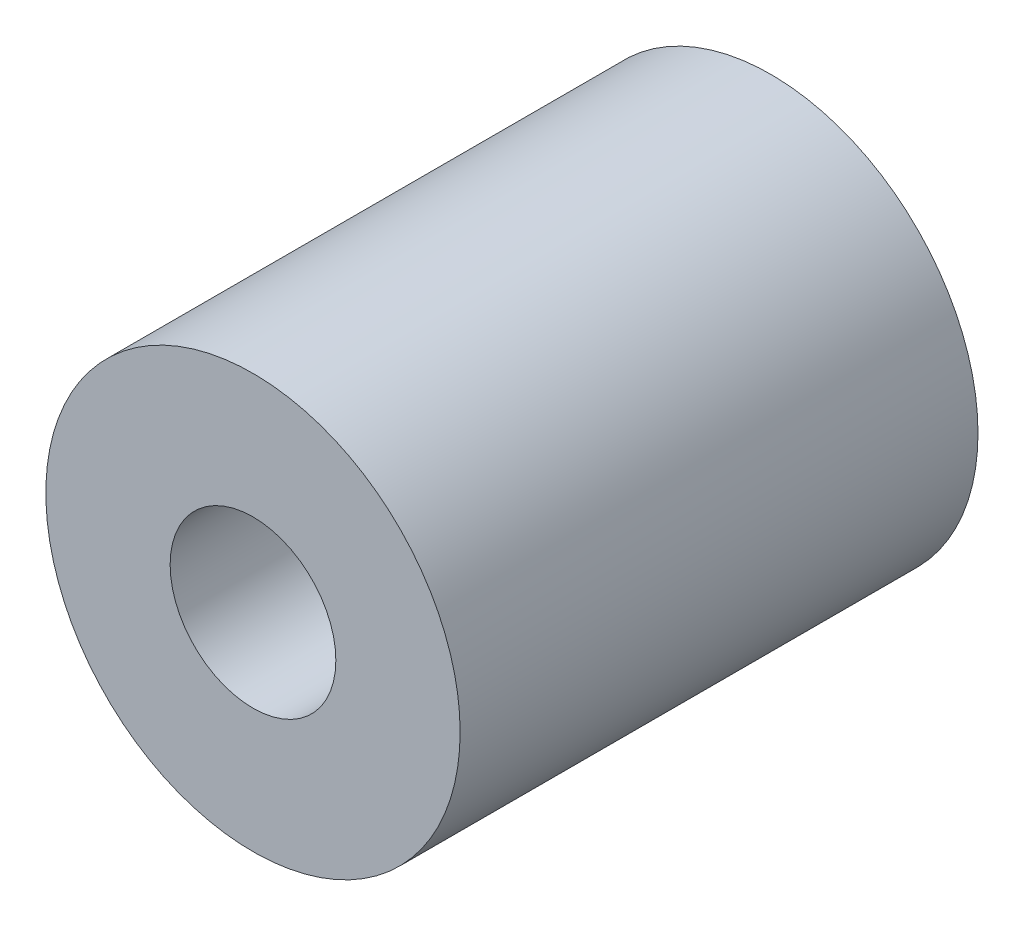
ISO-10303-21;
HEADER;
FILE_DESCRIPTION(('STEP AP214'),'2;1');
FILE_NAME('part.step','',(''),(''),'','','');
FILE_SCHEMA(('AUTOMOTIVE_DESIGN { 1 0 10303 214 1 1 1 1 }'));
ENDSEC;
DATA;
#1=APPLICATION_CONTEXT('core data for automotive mechanical design processes');
#2=APPLICATION_PROTOCOL_DEFINITION('international standard','automotive_design',2000,#1);
#3=PRODUCT_CONTEXT('',#1,'mechanical');
#4=PRODUCT('Part','Part','',(#3));
#5=PRODUCT_RELATED_PRODUCT_CATEGORY('part','',(#4));
#6=PRODUCT_DEFINITION_FORMATION('','',#4);
#7=PRODUCT_DEFINITION_CONTEXT('part definition',#1,'design');
#8=PRODUCT_DEFINITION('design','',#6,#7);
#9=PRODUCT_DEFINITION_SHAPE('','',#8);
#10=(LENGTH_UNIT() NAMED_UNIT(*) SI_UNIT(.MILLI.,.METRE.));
#11=(NAMED_UNIT(*) PLANE_ANGLE_UNIT() SI_UNIT($,.RADIAN.));
#12=(NAMED_UNIT(*) SI_UNIT($,.STERADIAN.) SOLID_ANGLE_UNIT());
#13=UNCERTAINTY_MEASURE_WITH_UNIT(LENGTH_MEASURE(1.E-05),#10,'distance_accuracy_value','');
#14=(GEOMETRIC_REPRESENTATION_CONTEXT(3) GLOBAL_UNCERTAINTY_ASSIGNED_CONTEXT((#13)) GLOBAL_UNIT_ASSIGNED_CONTEXT((#10,
#11,#12)) REPRESENTATION_CONTEXT('',''));
#15=CARTESIAN_POINT('',(0.,0.,0.));
#16=DIRECTION('',(0.,0.,1.));
#17=DIRECTION('',(1.,0.,0.));
#18=AXIS2_PLACEMENT_3D('',#15,#16,#17);
#19=CARTESIAN_POINT('',(0.,0.,12.5));
#20=DIRECTION('',(0.,0.,1.));
#21=DIRECTION('',(1.,0.,0.));
#22=AXIS2_PLACEMENT_3D('',#19,#20,#21);
#23=PLANE('',#22);
#24=CARTESIAN_POINT('',(0.,0.,12.5));
#25=DIRECTION('',(0.,0.,1.));
#26=DIRECTION('',(1.,0.,0.));
#27=AXIS2_PLACEMENT_3D('',#24,#25,#26);
#28=CIRCLE('',#27,2.);
#29=CARTESIAN_POINT('',(2.,0.,12.5));
#30=VERTEX_POINT('',#29);
#31=EDGE_CURVE('E39',#30,#30,#28,.T.);
#32=ORIENTED_EDGE('',*,*,#31,.F.);
#33=EDGE_LOOP('',(#32));
#34=FACE_BOUND('',#33,.T.);
#35=CARTESIAN_POINT('',(0.,0.,12.5));
#36=DIRECTION('',(0.,0.,1.));
#37=DIRECTION('',(1.,0.,0.));
#38=AXIS2_PLACEMENT_3D('',#35,#36,#37);
#39=CIRCLE('',#38,4.);
#40=CARTESIAN_POINT('',(4.,0.,12.5));
#41=VERTEX_POINT('',#40);
#42=EDGE_CURVE('E53',#41,#41,#39,.T.);
#43=ORIENTED_EDGE('',*,*,#42,.T.);
#44=EDGE_LOOP('',(#43));
#45=FACE_BOUND('',#44,.T.);
#46=ADVANCED_FACE('F32',(#34,#45),#23,.T.);
#47=CARTESIAN_POINT('',(0.,0.,0.));
#48=DIRECTION('',(0.,0.,1.));
#49=DIRECTION('',(1.,0.,0.));
#50=AXIS2_PLACEMENT_3D('',#47,#48,#49);
#51=PLANE('',#50);
#52=CARTESIAN_POINT('',(0.,0.,0.));
#53=DIRECTION('',(0.,0.,1.));
#54=DIRECTION('',(1.,0.,0.));
#55=AXIS2_PLACEMENT_3D('',#52,#53,#54);
#56=CIRCLE('',#55,10.);
#57=CARTESIAN_POINT('',(10.,0.,0.));
#58=VERTEX_POINT('',#57);
#59=EDGE_CURVE('E10',#58,#58,#56,.T.);
#60=ORIENTED_EDGE('',*,*,#59,.F.);
#61=EDGE_LOOP('',(#60));
#62=FACE_BOUND('',#61,.T.);
#63=CARTESIAN_POINT('',(0.,0.,0.));
#64=DIRECTION('',(0.,0.,1.));
#65=DIRECTION('',(1.,0.,0.));
#66=AXIS2_PLACEMENT_3D('',#63,#64,#65);
#67=CIRCLE('',#66,2.);
#68=CARTESIAN_POINT('',(2.,0.,0.));
#69=VERTEX_POINT('',#68);
#70=EDGE_CURVE('E43',#69,#69,#67,.T.);
#71=ORIENTED_EDGE('',*,*,#70,.T.);
#72=EDGE_LOOP('',(#71));
#73=FACE_BOUND('',#72,.T.);
#74=ADVANCED_FACE('F74',(#62,#73),#51,.F.);
#75=CARTESIAN_POINT('',(0.,0.,12.5));
#76=DIRECTION('',(0.,0.,-1.));
#77=DIRECTION('',(-1.,0.,0.));
#78=AXIS2_PLACEMENT_3D('',#75,#76,#77);
#79=CYLINDRICAL_SURFACE('',#78,10.);
#80=ORIENTED_EDGE('',*,*,#59,.T.);
#81=EDGE_LOOP('',(#80));
#82=FACE_BOUND('',#81,.T.);
#83=CARTESIAN_POINT('',(0.,0.,25.));
#84=DIRECTION('',(0.,0.,1.));
#85=DIRECTION('',(1.,0.,0.));
#86=AXIS2_PLACEMENT_3D('',#83,#84,#85);
#87=CIRCLE('',#86,10.);
#88=CARTESIAN_POINT('',(10.,0.,25.));
#89=VERTEX_POINT('',#88);
#90=EDGE_CURVE('E48',#89,#89,#87,.T.);
#91=ORIENTED_EDGE('',*,*,#90,.F.);
#92=EDGE_LOOP('',(#91));
#93=FACE_BOUND('',#92,.T.);
#94=ADVANCED_FACE('F34',(#82,#93),#79,.T.);
#95=CARTESIAN_POINT('',(0.,0.,12.5));
#96=DIRECTION('',(0.,0.,-1.));
#97=DIRECTION('',(-1.,0.,0.));
#98=AXIS2_PLACEMENT_3D('',#95,#96,#97);
#99=CYLINDRICAL_SURFACE('',#98,2.);
#100=ORIENTED_EDGE('',*,*,#31,.T.);
#101=EDGE_LOOP('',(#100));
#102=FACE_BOUND('',#101,.T.);
#103=ORIENTED_EDGE('',*,*,#70,.F.);
#104=EDGE_LOOP('',(#103));
#105=FACE_BOUND('',#104,.T.);
#106=ADVANCED_FACE('F64',(#102,#105),#99,.F.);
#107=CARTESIAN_POINT('',(0.,0.,25.));
#108=DIRECTION('',(0.,0.,1.));
#109=DIRECTION('',(1.,0.,0.));
#110=AXIS2_PLACEMENT_3D('',#107,#108,#109);
#111=PLANE('',#110);
#112=ORIENTED_EDGE('',*,*,#90,.T.);
#113=EDGE_LOOP('',(#112));
#114=FACE_BOUND('',#113,.T.);
#115=CARTESIAN_POINT('',(0.,0.,25.));
#116=DIRECTION('',(0.,0.,1.));
#117=DIRECTION('',(1.,0.,0.));
#118=AXIS2_PLACEMENT_3D('',#115,#116,#117);
#119=CIRCLE('',#118,4.);
#120=CARTESIAN_POINT('',(4.,0.,25.));
#121=VERTEX_POINT('',#120);
#122=EDGE_CURVE('E52',#121,#121,#119,.T.);
#123=ORIENTED_EDGE('',*,*,#122,.F.);
#124=EDGE_LOOP('',(#123));
#125=FACE_BOUND('',#124,.T.);
#126=ADVANCED_FACE('F62',(#114,#125),#111,.T.);
#127=CARTESIAN_POINT('',(0.,0.,25.));
#128=DIRECTION('',(0.,0.,-1.));
#129=DIRECTION('',(-1.,0.,0.));
#130=AXIS2_PLACEMENT_3D('',#127,#128,#129);
#131=CYLINDRICAL_SURFACE('',#130,4.);
#132=ORIENTED_EDGE('',*,*,#122,.T.);
#133=EDGE_LOOP('',(#132));
#134=FACE_BOUND('',#133,.T.);
#135=ORIENTED_EDGE('',*,*,#42,.F.);
#136=EDGE_LOOP('',(#135));
#137=FACE_BOUND('',#136,.T.);
#138=ADVANCED_FACE('F59',(#134,#137),#131,.F.);
#139=CLOSED_SHELL('',(#46,#74,#94,#106,#126,#138));
#140=MANIFOLD_SOLID_BREP('B2',#139);
#141=ADVANCED_BREP_SHAPE_REPRESENTATION('',(#18,#140),#14);
#142=SHAPE_DEFINITION_REPRESENTATION(#9,#141);
ENDSEC;
END-ISO-10303-21;
